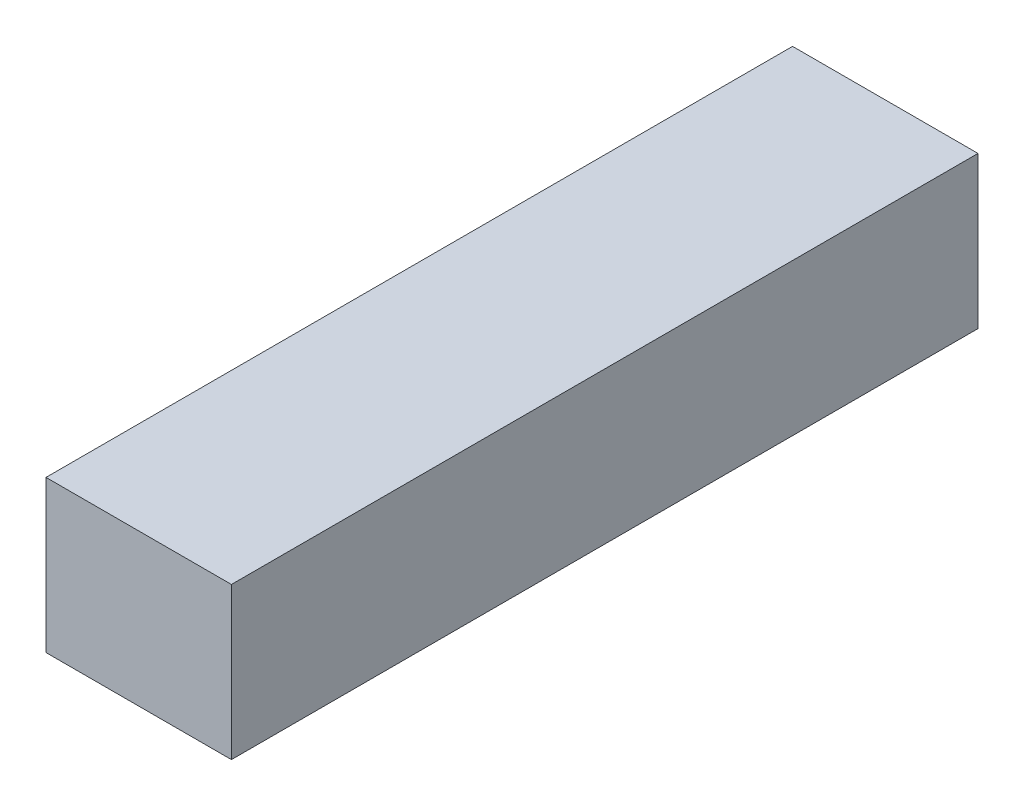
ISO-10303-21;
HEADER;
FILE_DESCRIPTION(('STEP AP214'),'2;1');
FILE_NAME('part.step','',(''),(''),'','','');
FILE_SCHEMA(('AUTOMOTIVE_DESIGN { 1 0 10303 214 1 1 1 1 }'));
ENDSEC;
DATA;
#1=APPLICATION_CONTEXT('core data for automotive mechanical design processes');
#2=APPLICATION_PROTOCOL_DEFINITION('international standard','automotive_design',2000,#1);
#3=PRODUCT_CONTEXT('',#1,'mechanical');
#4=PRODUCT('Part','Part','',(#3));
#5=PRODUCT_RELATED_PRODUCT_CATEGORY('part','',(#4));
#6=PRODUCT_DEFINITION_FORMATION('','',#4);
#7=PRODUCT_DEFINITION_CONTEXT('part definition',#1,'design');
#8=PRODUCT_DEFINITION('design','',#6,#7);
#9=PRODUCT_DEFINITION_SHAPE('','',#8);
#10=(LENGTH_UNIT() NAMED_UNIT(*) SI_UNIT(.MILLI.,.METRE.));
#11=(NAMED_UNIT(*) PLANE_ANGLE_UNIT() SI_UNIT($,.RADIAN.));
#12=(NAMED_UNIT(*) SI_UNIT($,.STERADIAN.) SOLID_ANGLE_UNIT());
#13=UNCERTAINTY_MEASURE_WITH_UNIT(LENGTH_MEASURE(1.E-05),#10,'distance_accuracy_value','');
#14=(GEOMETRIC_REPRESENTATION_CONTEXT(3) GLOBAL_UNCERTAINTY_ASSIGNED_CONTEXT((#13)) GLOBAL_UNIT_ASSIGNED_CONTEXT((#10,
#11,#12)) REPRESENTATION_CONTEXT('',''));
#15=CARTESIAN_POINT('',(0.,0.,0.));
#16=DIRECTION('',(0.,0.,1.));
#17=DIRECTION('',(1.,0.,0.));
#18=AXIS2_PLACEMENT_3D('',#15,#16,#17);
#19=CARTESIAN_POINT('',(7.7,-6.3,31.));
#20=DIRECTION('',(-1.,0.,0.));
#21=DIRECTION('',(0.,0.,1.));
#22=AXIS2_PLACEMENT_3D('',#19,#20,#21);
#23=PLANE('',#22);
#24=DIRECTION('',(0.,1.,0.));
#25=VECTOR('',#24,1.);
#26=CARTESIAN_POINT('',(7.7,-6.3,-31.));
#27=LINE('',#26,#25);
#28=CARTESIAN_POINT('',(7.7,-6.3,-31.));
#29=VERTEX_POINT('',#28);
#30=CARTESIAN_POINT('',(7.7,6.3,-31.));
#31=VERTEX_POINT('',#30);
#32=EDGE_CURVE('E115',#29,#31,#27,.T.);
#33=ORIENTED_EDGE('',*,*,#32,.T.);
#34=DIRECTION('',(0.,0.,-1.));
#35=VECTOR('',#34,1.);
#36=CARTESIAN_POINT('',(7.7,6.3,31.));
#37=LINE('',#36,#35);
#38=CARTESIAN_POINT('',(7.7,6.3,31.));
#39=VERTEX_POINT('',#38);
#40=EDGE_CURVE('E11',#39,#31,#37,.T.);
#41=ORIENTED_EDGE('',*,*,#40,.F.);
#42=DIRECTION('',(0.,1.,0.));
#43=VECTOR('',#42,1.);
#44=CARTESIAN_POINT('',(7.7,-6.3,31.));
#45=LINE('',#44,#43);
#46=CARTESIAN_POINT('',(7.7,-6.3,31.));
#47=VERTEX_POINT('',#46);
#48=EDGE_CURVE('E99',#47,#39,#45,.T.);
#49=ORIENTED_EDGE('',*,*,#48,.F.);
#50=DIRECTION('',(0.,0.,-1.));
#51=VECTOR('',#50,1.);
#52=CARTESIAN_POINT('',(7.7,-6.3,31.));
#53=LINE('',#52,#51);
#54=EDGE_CURVE('E111',#47,#29,#53,.T.);
#55=ORIENTED_EDGE('',*,*,#54,.T.);
#56=EDGE_LOOP('',(#33,#41,#49,#55));
#57=FACE_BOUND('',#56,.T.);
#58=ADVANCED_FACE('F47',(#57),#23,.F.);
#59=CARTESIAN_POINT('',(-7.7,6.3,31.));
#60=DIRECTION('',(0.,-1.,0.));
#61=DIRECTION('',(0.,0.,-1.));
#62=AXIS2_PLACEMENT_3D('',#59,#60,#61);
#63=PLANE('',#62);
#64=DIRECTION('',(-1.,0.,0.));
#65=VECTOR('',#64,1.);
#66=CARTESIAN_POINT('',(-7.7,6.3,-31.));
#67=LINE('',#66,#65);
#68=CARTESIAN_POINT('',(-7.7,6.3,-31.));
#69=VERTEX_POINT('',#68);
#70=EDGE_CURVE('E104',#31,#69,#67,.T.);
#71=ORIENTED_EDGE('',*,*,#70,.T.);
#72=DIRECTION('',(0.,0.,-1.));
#73=VECTOR('',#72,1.);
#74=CARTESIAN_POINT('',(-7.7,6.3,31.));
#75=LINE('',#74,#73);
#76=CARTESIAN_POINT('',(-7.7,6.3,31.));
#77=VERTEX_POINT('',#76);
#78=EDGE_CURVE('E56',#77,#69,#75,.T.);
#79=ORIENTED_EDGE('',*,*,#78,.F.);
#80=DIRECTION('',(-1.,0.,0.));
#81=VECTOR('',#80,1.);
#82=CARTESIAN_POINT('',(-7.7,6.3,31.));
#83=LINE('',#82,#81);
#84=EDGE_CURVE('E94',#39,#77,#83,.T.);
#85=ORIENTED_EDGE('',*,*,#84,.F.);
#86=ORIENTED_EDGE('',*,*,#40,.T.);
#87=EDGE_LOOP('',(#71,#79,#85,#86));
#88=FACE_BOUND('',#87,.T.);
#89=ADVANCED_FACE('F103',(#88),#63,.F.);
#90=CARTESIAN_POINT('',(-7.7,-6.3,31.));
#91=DIRECTION('',(1.,0.,0.));
#92=DIRECTION('',(0.,0.,-1.));
#93=AXIS2_PLACEMENT_3D('',#90,#91,#92);
#94=PLANE('',#93);
#95=DIRECTION('',(0.,-1.,0.));
#96=VECTOR('',#95,1.);
#97=CARTESIAN_POINT('',(-7.7,-6.3,-31.));
#98=LINE('',#97,#96);
#99=CARTESIAN_POINT('',(-7.7,-6.3,-31.));
#100=VERTEX_POINT('',#99);
#101=EDGE_CURVE('E81',#69,#100,#98,.T.);
#102=ORIENTED_EDGE('',*,*,#101,.T.);
#103=DIRECTION('',(0.,0.,-1.));
#104=VECTOR('',#103,1.);
#105=CARTESIAN_POINT('',(-7.7,-6.3,31.));
#106=LINE('',#105,#104);
#107=CARTESIAN_POINT('',(-7.7,-6.3,31.));
#108=VERTEX_POINT('',#107);
#109=EDGE_CURVE('E106',#108,#100,#106,.T.);
#110=ORIENTED_EDGE('',*,*,#109,.F.);
#111=DIRECTION('',(0.,-1.,0.));
#112=VECTOR('',#111,1.);
#113=CARTESIAN_POINT('',(-7.7,-6.3,31.));
#114=LINE('',#113,#112);
#115=EDGE_CURVE('E97',#77,#108,#114,.T.);
#116=ORIENTED_EDGE('',*,*,#115,.F.);
#117=ORIENTED_EDGE('',*,*,#78,.T.);
#118=EDGE_LOOP('',(#102,#110,#116,#117));
#119=FACE_BOUND('',#118,.T.);
#120=ADVANCED_FACE('F107',(#119),#94,.F.);
#121=CARTESIAN_POINT('',(-7.7,-6.3,31.));
#122=DIRECTION('',(0.,1.,0.));
#123=DIRECTION('',(0.,0.,1.));
#124=AXIS2_PLACEMENT_3D('',#121,#122,#123);
#125=PLANE('',#124);
#126=DIRECTION('',(1.,0.,0.));
#127=VECTOR('',#126,1.);
#128=CARTESIAN_POINT('',(-7.7,-6.3,-31.));
#129=LINE('',#128,#127);
#130=EDGE_CURVE('E87',#100,#29,#129,.T.);
#131=ORIENTED_EDGE('',*,*,#130,.T.);
#132=ORIENTED_EDGE('',*,*,#54,.F.);
#133=DIRECTION('',(1.,0.,0.));
#134=VECTOR('',#133,1.);
#135=CARTESIAN_POINT('',(-7.7,-6.3,31.));
#136=LINE('',#135,#134);
#137=EDGE_CURVE('E64',#108,#47,#136,.T.);
#138=ORIENTED_EDGE('',*,*,#137,.F.);
#139=ORIENTED_EDGE('',*,*,#109,.T.);
#140=EDGE_LOOP('',(#131,#132,#138,#139));
#141=FACE_BOUND('',#140,.T.);
#142=ADVANCED_FACE('F128',(#141),#125,.F.);
#143=CARTESIAN_POINT('',(0.,0.,31.));
#144=DIRECTION('',(0.,0.,-1.));
#145=DIRECTION('',(-1.,0.,0.));
#146=AXIS2_PLACEMENT_3D('',#143,#144,#145);
#147=PLANE('',#146);
#148=ORIENTED_EDGE('',*,*,#48,.T.);
#149=ORIENTED_EDGE('',*,*,#84,.T.);
#150=ORIENTED_EDGE('',*,*,#115,.T.);
#151=ORIENTED_EDGE('',*,*,#137,.T.);
#152=EDGE_LOOP('',(#148,#149,#150,#151));
#153=FACE_BOUND('',#152,.T.);
#154=ADVANCED_FACE('F95',(#153),#147,.F.);
#155=CARTESIAN_POINT('',(0.,0.,-31.));
#156=DIRECTION('',(0.,0.,-1.));
#157=DIRECTION('',(-1.,0.,0.));
#158=AXIS2_PLACEMENT_3D('',#155,#156,#157);
#159=PLANE('',#158);
#160=ORIENTED_EDGE('',*,*,#32,.F.);
#161=ORIENTED_EDGE('',*,*,#130,.F.);
#162=ORIENTED_EDGE('',*,*,#101,.F.);
#163=ORIENTED_EDGE('',*,*,#70,.F.);
#164=EDGE_LOOP('',(#160,#161,#162,#163));
#165=FACE_BOUND('',#164,.T.);
#166=ADVANCED_FACE('F131',(#165),#159,.T.);
#167=CLOSED_SHELL('',(#58,#89,#120,#142,#154,#166));
#168=MANIFOLD_SOLID_BREP('B2',#167);
#169=ADVANCED_BREP_SHAPE_REPRESENTATION('',(#18,#168),#14);
#170=SHAPE_DEFINITION_REPRESENTATION(#9,#169);
ENDSEC;
END-ISO-10303-21;
